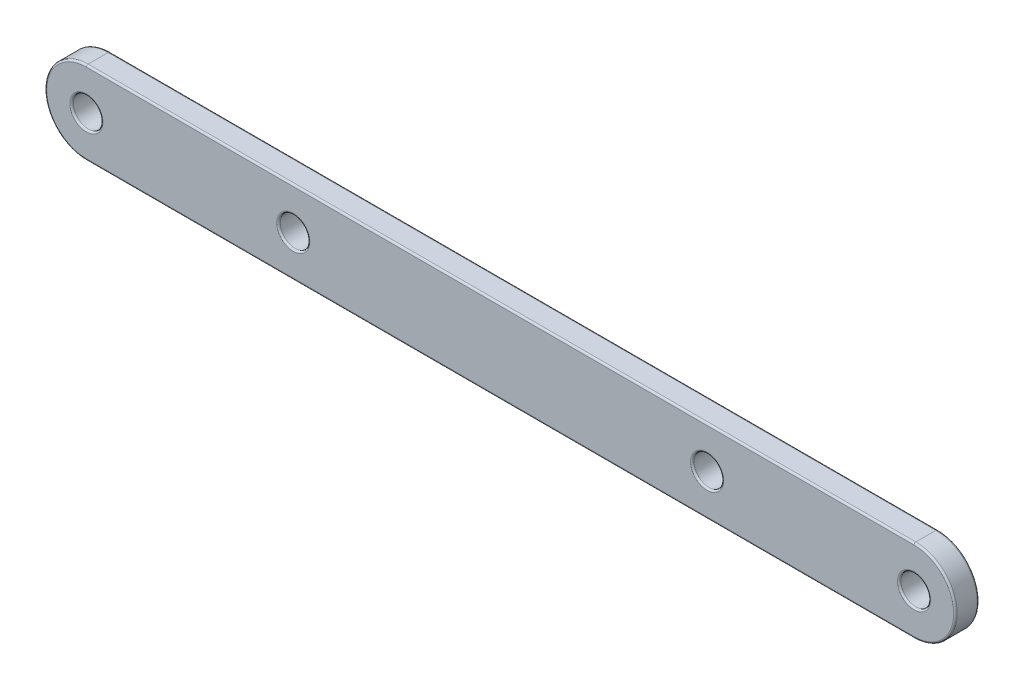
ISO-10303-21;
HEADER;
FILE_DESCRIPTION(('STEP AP214'),'2;1');
FILE_NAME('part.step','',(''),(''),'','','');
FILE_SCHEMA(('AUTOMOTIVE_DESIGN { 1 0 10303 214 1 1 1 1 }'));
ENDSEC;
DATA;
#1=APPLICATION_CONTEXT('core data for automotive mechanical design processes');
#2=APPLICATION_PROTOCOL_DEFINITION('international standard','automotive_design',2000,#1);
#3=PRODUCT_CONTEXT('',#1,'mechanical');
#4=PRODUCT('Part','Part','',(#3));
#5=PRODUCT_RELATED_PRODUCT_CATEGORY('part','',(#4));
#6=PRODUCT_DEFINITION_FORMATION('','',#4);
#7=PRODUCT_DEFINITION_CONTEXT('part definition',#1,'design');
#8=PRODUCT_DEFINITION('design','',#6,#7);
#9=PRODUCT_DEFINITION_SHAPE('','',#8);
#10=(LENGTH_UNIT() NAMED_UNIT(*) SI_UNIT(.MILLI.,.METRE.));
#11=(NAMED_UNIT(*) PLANE_ANGLE_UNIT() SI_UNIT($,.RADIAN.));
#12=(NAMED_UNIT(*) SI_UNIT($,.STERADIAN.) SOLID_ANGLE_UNIT());
#13=UNCERTAINTY_MEASURE_WITH_UNIT(LENGTH_MEASURE(1.E-05),#10,'distance_accuracy_value','');
#14=(GEOMETRIC_REPRESENTATION_CONTEXT(3) GLOBAL_UNCERTAINTY_ASSIGNED_CONTEXT((#13)) GLOBAL_UNIT_ASSIGNED_CONTEXT((#10,
#11,#12)) REPRESENTATION_CONTEXT('',''));
#15=CARTESIAN_POINT('',(0.,0.,0.));
#16=DIRECTION('',(0.,0.,1.));
#17=DIRECTION('',(1.,0.,0.));
#18=AXIS2_PLACEMENT_3D('',#15,#16,#17);
#19=CARTESIAN_POINT('',(-35.,0.,2.));
#20=DIRECTION('',(0.,0.,1.));
#21=DIRECTION('',(1.,0.,0.));
#22=AXIS2_PLACEMENT_3D('',#19,#20,#21);
#23=PLANE('',#22);
#24=CARTESIAN_POINT('',(17.5,0.,2.));
#25=DIRECTION('',(0.,0.,1.));
#26=DIRECTION('',(1.,0.,0.));
#27=AXIS2_PLACEMENT_3D('',#24,#25,#26);
#28=CIRCLE('',#27,1.4);
#29=CARTESIAN_POINT('',(18.9,0.,2.));
#30=VERTEX_POINT('',#29);
#31=EDGE_CURVE('E167',#30,#30,#28,.F.);
#32=ORIENTED_EDGE('',*,*,#31,.T.);
#33=EDGE_LOOP('',(#32));
#34=FACE_BOUND('',#33,.T.);
#35=CARTESIAN_POINT('',(35.,0.,2.));
#36=DIRECTION('',(0.,0.,1.));
#37=DIRECTION('',(1.,0.,0.));
#38=AXIS2_PLACEMENT_3D('',#35,#36,#37);
#39=CIRCLE('',#38,1.4);
#40=CARTESIAN_POINT('',(36.4,0.,2.));
#41=VERTEX_POINT('',#40);
#42=EDGE_CURVE('E164',#41,#41,#39,.F.);
#43=ORIENTED_EDGE('',*,*,#42,.T.);
#44=EDGE_LOOP('',(#43));
#45=FACE_BOUND('',#44,.T.);
#46=CARTESIAN_POINT('',(-35.,0.,2.));
#47=DIRECTION('',(0.,0.,1.));
#48=DIRECTION('',(1.,0.,0.));
#49=AXIS2_PLACEMENT_3D('',#46,#47,#48);
#50=CIRCLE('',#49,1.4);
#51=CARTESIAN_POINT('',(-33.6,0.,2.));
#52=VERTEX_POINT('',#51);
#53=EDGE_CURVE('E161',#52,#52,#50,.F.);
#54=ORIENTED_EDGE('',*,*,#53,.T.);
#55=EDGE_LOOP('',(#54));
#56=FACE_BOUND('',#55,.T.);
#57=CARTESIAN_POINT('',(-17.5,0.,2.));
#58=DIRECTION('',(0.,0.,1.));
#59=DIRECTION('',(1.,0.,0.));
#60=AXIS2_PLACEMENT_3D('',#57,#58,#59);
#61=CIRCLE('',#60,1.4);
#62=CARTESIAN_POINT('',(-16.1,0.,2.));
#63=VERTEX_POINT('',#62);
#64=EDGE_CURVE('E158',#63,#63,#61,.F.);
#65=ORIENTED_EDGE('',*,*,#64,.T.);
#66=EDGE_LOOP('',(#65));
#67=FACE_BOUND('',#66,.T.);
#68=DIRECTION('',(-1.,0.,0.));
#69=VECTOR('',#68,1.);
#70=CARTESIAN_POINT('',(-35.,3.35,2.));
#71=LINE('',#70,#69);
#72=CARTESIAN_POINT('',(35.,3.35000000000001,2.));
#73=VERTEX_POINT('',#72);
#74=CARTESIAN_POINT('',(-35.,3.35,2.));
#75=VERTEX_POINT('',#74);
#76=EDGE_CURVE('E149',#73,#75,#71,.T.);
#77=ORIENTED_EDGE('',*,*,#76,.T.);
#78=CARTESIAN_POINT('',(-35.,0.,2.));
#79=DIRECTION('',(0.,0.,1.));
#80=DIRECTION('',(1.,0.,0.));
#81=AXIS2_PLACEMENT_3D('',#78,#79,#80);
#82=CIRCLE('',#81,3.35);
#83=CARTESIAN_POINT('',(-35.,-3.35,2.));
#84=VERTEX_POINT('',#83);
#85=EDGE_CURVE('E155',#75,#84,#82,.T.);
#86=ORIENTED_EDGE('',*,*,#85,.T.);
#87=DIRECTION('',(1.,0.,0.));
#88=VECTOR('',#87,1.);
#89=CARTESIAN_POINT('',(35.,-3.34999999999999,2.));
#90=LINE('',#89,#88);
#91=CARTESIAN_POINT('',(35.,-3.34999999999999,2.));
#92=VERTEX_POINT('',#91);
#93=EDGE_CURVE('E153',#84,#92,#90,.T.);
#94=ORIENTED_EDGE('',*,*,#93,.T.);
#95=CARTESIAN_POINT('',(35.,0.,2.));
#96=DIRECTION('',(0.,0.,1.));
#97=DIRECTION('',(1.,0.,0.));
#98=AXIS2_PLACEMENT_3D('',#95,#96,#97);
#99=CIRCLE('',#98,3.35);
#100=EDGE_CURVE('E151',#92,#73,#99,.T.);
#101=ORIENTED_EDGE('',*,*,#100,.T.);
#102=EDGE_LOOP('',(#77,#86,#94,#101));
#103=FACE_BOUND('',#102,.T.);
#104=ADVANCED_FACE('F33',(#34,#45,#56,#67,#103),#23,.T.);
#105=CARTESIAN_POINT('',(-35.,0.,0.));
#106=DIRECTION('',(0.,0.,1.));
#107=DIRECTION('',(1.,0.,0.));
#108=AXIS2_PLACEMENT_3D('',#105,#106,#107);
#109=PLANE('',#108);
#110=CARTESIAN_POINT('',(17.5,0.,0.));
#111=DIRECTION('',(0.,0.,1.));
#112=DIRECTION('',(1.,0.,0.));
#113=AXIS2_PLACEMENT_3D('',#110,#111,#112);
#114=CIRCLE('',#113,1.4);
#115=CARTESIAN_POINT('',(18.9,0.,0.));
#116=VERTEX_POINT('',#115);
#117=EDGE_CURVE('E140',#116,#116,#114,.T.);
#118=ORIENTED_EDGE('',*,*,#117,.T.);
#119=EDGE_LOOP('',(#118));
#120=FACE_BOUND('',#119,.T.);
#121=CARTESIAN_POINT('',(35.,0.,0.));
#122=DIRECTION('',(0.,0.,1.));
#123=DIRECTION('',(1.,0.,0.));
#124=AXIS2_PLACEMENT_3D('',#121,#122,#123);
#125=CIRCLE('',#124,1.4);
#126=CARTESIAN_POINT('',(36.4,0.,0.));
#127=VERTEX_POINT('',#126);
#128=EDGE_CURVE('E137',#127,#127,#125,.T.);
#129=ORIENTED_EDGE('',*,*,#128,.T.);
#130=EDGE_LOOP('',(#129));
#131=FACE_BOUND('',#130,.T.);
#132=CARTESIAN_POINT('',(-35.,0.,0.));
#133=DIRECTION('',(0.,0.,1.));
#134=DIRECTION('',(1.,0.,0.));
#135=AXIS2_PLACEMENT_3D('',#132,#133,#134);
#136=CIRCLE('',#135,1.4);
#137=CARTESIAN_POINT('',(-33.6,0.,0.));
#138=VERTEX_POINT('',#137);
#139=EDGE_CURVE('E130',#138,#138,#136,.T.);
#140=ORIENTED_EDGE('',*,*,#139,.T.);
#141=EDGE_LOOP('',(#140));
#142=FACE_BOUND('',#141,.T.);
#143=CARTESIAN_POINT('',(-17.5,0.,0.));
#144=DIRECTION('',(0.,0.,1.));
#145=DIRECTION('',(1.,0.,0.));
#146=AXIS2_PLACEMENT_3D('',#143,#144,#145);
#147=CIRCLE('',#146,1.4);
#148=CARTESIAN_POINT('',(-16.1,0.,0.));
#149=VERTEX_POINT('',#148);
#150=EDGE_CURVE('E127',#149,#149,#147,.T.);
#151=ORIENTED_EDGE('',*,*,#150,.T.);
#152=EDGE_LOOP('',(#151));
#153=FACE_BOUND('',#152,.T.);
#154=DIRECTION('',(1.,0.,0.));
#155=VECTOR('',#154,1.);
#156=CARTESIAN_POINT('',(-35.,-3.35,0.));
#157=LINE('',#156,#155);
#158=CARTESIAN_POINT('',(35.,-3.34999999999999,0.));
#159=VERTEX_POINT('',#158);
#160=CARTESIAN_POINT('',(-35.,-3.35,0.));
#161=VERTEX_POINT('',#160);
#162=EDGE_CURVE('E126',#159,#161,#157,.F.);
#163=ORIENTED_EDGE('',*,*,#162,.T.);
#164=CARTESIAN_POINT('',(-35.,0.,0.));
#165=DIRECTION('',(0.,0.,1.));
#166=DIRECTION('',(1.,0.,0.));
#167=AXIS2_PLACEMENT_3D('',#164,#165,#166);
#168=CIRCLE('',#167,3.35);
#169=CARTESIAN_POINT('',(-35.,3.35,0.));
#170=VERTEX_POINT('',#169);
#171=EDGE_CURVE('E105',#161,#170,#168,.F.);
#172=ORIENTED_EDGE('',*,*,#171,.T.);
#173=DIRECTION('',(-1.,0.,0.));
#174=VECTOR('',#173,1.);
#175=CARTESIAN_POINT('',(-35.,3.35,0.));
#176=LINE('',#175,#174);
#177=CARTESIAN_POINT('',(35.,3.35000000000001,0.));
#178=VERTEX_POINT('',#177);
#179=EDGE_CURVE('E115',#170,#178,#176,.F.);
#180=ORIENTED_EDGE('',*,*,#179,.T.);
#181=CARTESIAN_POINT('',(35.,0.,0.));
#182=DIRECTION('',(0.,0.,1.));
#183=DIRECTION('',(1.,0.,0.));
#184=AXIS2_PLACEMENT_3D('',#181,#182,#183);
#185=CIRCLE('',#184,3.35);
#186=EDGE_CURVE('E121',#178,#159,#185,.F.);
#187=ORIENTED_EDGE('',*,*,#186,.T.);
#188=EDGE_LOOP('',(#163,#172,#180,#187));
#189=FACE_BOUND('',#188,.T.);
#190=ADVANCED_FACE('F124',(#120,#131,#142,#153,#189),#109,.F.);
#191=CARTESIAN_POINT('',(-35.,0.,2.));
#192=DIRECTION('',(0.,0.,-1.));
#193=DIRECTION('',(-1.,0.,0.));
#194=AXIS2_PLACEMENT_3D('',#191,#192,#193);
#195=CYLINDRICAL_SURFACE('',#194,3.5);
#196=DIRECTION('',(0.,0.,-1.));
#197=VECTOR('',#196,1.);
#198=CARTESIAN_POINT('',(-35.,3.5,2.));
#199=LINE('',#198,#197);
#200=CARTESIAN_POINT('',(-35.,3.5,1.85));
#201=VERTEX_POINT('',#200);
#202=CARTESIAN_POINT('',(-35.,3.5,0.15));
#203=VERTEX_POINT('',#202);
#204=EDGE_CURVE('E204',#201,#203,#199,.T.);
#205=ORIENTED_EDGE('',*,*,#204,.T.);
#206=CARTESIAN_POINT('',(-35.,0.,0.15));
#207=DIRECTION('',(0.,0.,1.));
#208=DIRECTION('',(1.,0.,0.));
#209=AXIS2_PLACEMENT_3D('',#206,#207,#208);
#210=CIRCLE('',#209,3.5);
#211=CARTESIAN_POINT('',(-35.,-3.5,0.15));
#212=VERTEX_POINT('',#211);
#213=EDGE_CURVE('E108',#203,#212,#210,.T.);
#214=ORIENTED_EDGE('',*,*,#213,.T.);
#215=DIRECTION('',(0.,0.,-1.));
#216=VECTOR('',#215,1.);
#217=CARTESIAN_POINT('',(-35.,-3.5,2.));
#218=LINE('',#217,#216);
#219=CARTESIAN_POINT('',(-35.,-3.5,1.85));
#220=VERTEX_POINT('',#219);
#221=EDGE_CURVE('E122',#220,#212,#218,.T.);
#222=ORIENTED_EDGE('',*,*,#221,.F.);
#223=CARTESIAN_POINT('',(-35.,0.,1.85));
#224=DIRECTION('',(0.,0.,1.));
#225=DIRECTION('',(1.,0.,0.));
#226=AXIS2_PLACEMENT_3D('',#223,#224,#225);
#227=CIRCLE('',#226,3.5);
#228=EDGE_CURVE('E188',#220,#201,#227,.F.);
#229=ORIENTED_EDGE('',*,*,#228,.T.);
#230=EDGE_LOOP('',(#205,#214,#222,#229));
#231=FACE_BOUND('',#230,.T.);
#232=ADVANCED_FACE('F243',(#231),#195,.T.);
#233=CARTESIAN_POINT('',(-35.,-3.5,2.));
#234=DIRECTION('',(0.,1.,0.));
#235=DIRECTION('',(-1.,0.,0.));
#236=AXIS2_PLACEMENT_3D('',#233,#234,#235);
#237=PLANE('',#236);
#238=ORIENTED_EDGE('',*,*,#221,.T.);
#239=DIRECTION('',(1.,0.,0.));
#240=VECTOR('',#239,1.);
#241=CARTESIAN_POINT('',(-35.,-3.5,0.15));
#242=LINE('',#241,#240);
#243=CARTESIAN_POINT('',(35.,-3.49999999999999,0.15));
#244=VERTEX_POINT('',#243);
#245=EDGE_CURVE('E194',#212,#244,#242,.T.);
#246=ORIENTED_EDGE('',*,*,#245,.T.);
#247=DIRECTION('',(0.,0.,-1.));
#248=VECTOR('',#247,1.);
#249=CARTESIAN_POINT('',(35.,-3.49999999999999,2.));
#250=LINE('',#249,#248);
#251=CARTESIAN_POINT('',(35.,-3.49999999999999,1.85));
#252=VERTEX_POINT('',#251);
#253=EDGE_CURVE('E225',#252,#244,#250,.T.);
#254=ORIENTED_EDGE('',*,*,#253,.F.);
#255=DIRECTION('',(1.,0.,0.));
#256=VECTOR('',#255,1.);
#257=CARTESIAN_POINT('',(-35.,-3.5,1.85));
#258=LINE('',#257,#256);
#259=EDGE_CURVE('E192',#252,#220,#258,.F.);
#260=ORIENTED_EDGE('',*,*,#259,.T.);
#261=EDGE_LOOP('',(#238,#246,#254,#260));
#262=FACE_BOUND('',#261,.T.);
#263=ADVANCED_FACE('F229',(#262),#237,.F.);
#264=CARTESIAN_POINT('',(35.,0.,2.));
#265=DIRECTION('',(0.,0.,-1.));
#266=DIRECTION('',(-1.,0.,0.));
#267=AXIS2_PLACEMENT_3D('',#264,#265,#266);
#268=CYLINDRICAL_SURFACE('',#267,3.5);
#269=ORIENTED_EDGE('',*,*,#253,.T.);
#270=CARTESIAN_POINT('',(35.,0.,0.15));
#271=DIRECTION('',(0.,0.,1.));
#272=DIRECTION('',(1.,0.,0.));
#273=AXIS2_PLACEMENT_3D('',#270,#271,#272);
#274=CIRCLE('',#273,3.5);
#275=CARTESIAN_POINT('',(35.,3.50000000000001,0.15));
#276=VERTEX_POINT('',#275);
#277=EDGE_CURVE('E50',#244,#276,#274,.T.);
#278=ORIENTED_EDGE('',*,*,#277,.T.);
#279=DIRECTION('',(0.,0.,-1.));
#280=VECTOR('',#279,1.);
#281=CARTESIAN_POINT('',(35.,3.50000000000001,2.));
#282=LINE('',#281,#280);
#283=CARTESIAN_POINT('',(35.,3.50000000000001,1.85));
#284=VERTEX_POINT('',#283);
#285=EDGE_CURVE('E226',#284,#276,#282,.T.);
#286=ORIENTED_EDGE('',*,*,#285,.F.);
#287=CARTESIAN_POINT('',(35.,0.,1.85));
#288=DIRECTION('',(0.,0.,1.));
#289=DIRECTION('',(1.,0.,0.));
#290=AXIS2_PLACEMENT_3D('',#287,#288,#289);
#291=CIRCLE('',#290,3.5);
#292=EDGE_CURVE('E196',#284,#252,#291,.F.);
#293=ORIENTED_EDGE('',*,*,#292,.T.);
#294=EDGE_LOOP('',(#269,#278,#286,#293));
#295=FACE_BOUND('',#294,.T.);
#296=ADVANCED_FACE('F224',(#295),#268,.T.);
#297=CARTESIAN_POINT('',(35.,3.50000000000001,2.));
#298=DIRECTION('',(0.,-1.,0.));
#299=DIRECTION('',(1.,0.,0.));
#300=AXIS2_PLACEMENT_3D('',#297,#298,#299);
#301=PLANE('',#300);
#302=ORIENTED_EDGE('',*,*,#285,.T.);
#303=DIRECTION('',(-1.,0.,0.));
#304=VECTOR('',#303,1.);
#305=CARTESIAN_POINT('',(35.,3.50000000000001,0.15));
#306=LINE('',#305,#304);
#307=EDGE_CURVE('E11',#276,#203,#306,.T.);
#308=ORIENTED_EDGE('',*,*,#307,.T.);
#309=ORIENTED_EDGE('',*,*,#204,.F.);
#310=DIRECTION('',(-1.,0.,0.));
#311=VECTOR('',#310,1.);
#312=CARTESIAN_POINT('',(35.,3.50000000000001,1.85));
#313=LINE('',#312,#311);
#314=EDGE_CURVE('E42',#201,#284,#313,.F.);
#315=ORIENTED_EDGE('',*,*,#314,.T.);
#316=EDGE_LOOP('',(#302,#308,#309,#315));
#317=FACE_BOUND('',#316,.T.);
#318=ADVANCED_FACE('F245',(#317),#301,.F.);
#319=CARTESIAN_POINT('',(-17.5,0.,2.));
#320=DIRECTION('',(0.,0.,-1.));
#321=DIRECTION('',(-1.,0.,0.));
#322=AXIS2_PLACEMENT_3D('',#319,#320,#321);
#323=CYLINDRICAL_SURFACE('',#322,1.25);
#324=CARTESIAN_POINT('',(-17.5,0.,0.15));
#325=DIRECTION('',(0.,0.,1.));
#326=DIRECTION('',(1.,0.,0.));
#327=AXIS2_PLACEMENT_3D('',#324,#325,#326);
#328=CIRCLE('',#327,1.25);
#329=CARTESIAN_POINT('',(-16.25,0.,0.15));
#330=VERTEX_POINT('',#329);
#331=EDGE_CURVE('E185',#330,#330,#328,.F.);
#332=ORIENTED_EDGE('',*,*,#331,.T.);
#333=EDGE_LOOP('',(#332));
#334=FACE_BOUND('',#333,.T.);
#335=CARTESIAN_POINT('',(-17.5,0.,1.85));
#336=DIRECTION('',(0.,0.,1.));
#337=DIRECTION('',(1.,0.,0.));
#338=AXIS2_PLACEMENT_3D('',#335,#336,#337);
#339=CIRCLE('',#338,1.25);
#340=CARTESIAN_POINT('',(-16.25,0.,1.85));
#341=VERTEX_POINT('',#340);
#342=EDGE_CURVE('E182',#341,#341,#339,.T.);
#343=ORIENTED_EDGE('',*,*,#342,.T.);
#344=EDGE_LOOP('',(#343));
#345=FACE_BOUND('',#344,.T.);
#346=ADVANCED_FACE('F247',(#334,#345),#323,.F.);
#347=CARTESIAN_POINT('',(-35.,0.,2.));
#348=DIRECTION('',(0.,0.,-1.));
#349=DIRECTION('',(-1.,0.,0.));
#350=AXIS2_PLACEMENT_3D('',#347,#348,#349);
#351=CYLINDRICAL_SURFACE('',#350,1.25);
#352=CARTESIAN_POINT('',(-35.,0.,0.15));
#353=DIRECTION('',(0.,0.,1.));
#354=DIRECTION('',(1.,0.,0.));
#355=AXIS2_PLACEMENT_3D('',#352,#353,#354);
#356=CIRCLE('',#355,1.25);
#357=CARTESIAN_POINT('',(-33.75,0.,0.15));
#358=VERTEX_POINT('',#357);
#359=EDGE_CURVE('E179',#358,#358,#356,.F.);
#360=ORIENTED_EDGE('',*,*,#359,.T.);
#361=EDGE_LOOP('',(#360));
#362=FACE_BOUND('',#361,.T.);
#363=CARTESIAN_POINT('',(-35.,0.,1.85));
#364=DIRECTION('',(0.,0.,1.));
#365=DIRECTION('',(1.,0.,0.));
#366=AXIS2_PLACEMENT_3D('',#363,#364,#365);
#367=CIRCLE('',#366,1.25);
#368=CARTESIAN_POINT('',(-33.75,0.,1.85));
#369=VERTEX_POINT('',#368);
#370=EDGE_CURVE('E176',#369,#369,#367,.T.);
#371=ORIENTED_EDGE('',*,*,#370,.T.);
#372=EDGE_LOOP('',(#371));
#373=FACE_BOUND('',#372,.T.);
#374=ADVANCED_FACE('F253',(#362,#373),#351,.F.);
#375=CARTESIAN_POINT('',(35.,0.,2.));
#376=DIRECTION('',(0.,0.,-1.));
#377=DIRECTION('',(-1.,0.,0.));
#378=AXIS2_PLACEMENT_3D('',#375,#376,#377);
#379=CYLINDRICAL_SURFACE('',#378,1.25);
#380=CARTESIAN_POINT('',(35.,0.,0.15));
#381=DIRECTION('',(0.,0.,1.));
#382=DIRECTION('',(1.,0.,0.));
#383=AXIS2_PLACEMENT_3D('',#380,#381,#382);
#384=CIRCLE('',#383,1.25);
#385=CARTESIAN_POINT('',(36.25,0.,0.15));
#386=VERTEX_POINT('',#385);
#387=EDGE_CURVE('E173',#386,#386,#384,.F.);
#388=ORIENTED_EDGE('',*,*,#387,.T.);
#389=EDGE_LOOP('',(#388));
#390=FACE_BOUND('',#389,.T.);
#391=CARTESIAN_POINT('',(35.,0.,1.85));
#392=DIRECTION('',(0.,0.,1.));
#393=DIRECTION('',(1.,0.,0.));
#394=AXIS2_PLACEMENT_3D('',#391,#392,#393);
#395=CIRCLE('',#394,1.25);
#396=CARTESIAN_POINT('',(36.25,0.,1.85));
#397=VERTEX_POINT('',#396);
#398=EDGE_CURVE('E170',#397,#397,#395,.T.);
#399=ORIENTED_EDGE('',*,*,#398,.T.);
#400=EDGE_LOOP('',(#399));
#401=FACE_BOUND('',#400,.T.);
#402=ADVANCED_FACE('F269',(#390,#401),#379,.F.);
#403=CARTESIAN_POINT('',(17.5,0.,2.));
#404=DIRECTION('',(0.,0.,-1.));
#405=DIRECTION('',(-1.,0.,0.));
#406=AXIS2_PLACEMENT_3D('',#403,#404,#405);
#407=CYLINDRICAL_SURFACE('',#406,1.25);
#408=CARTESIAN_POINT('',(17.5,0.,0.15));
#409=DIRECTION('',(0.,0.,1.));
#410=DIRECTION('',(1.,0.,0.));
#411=AXIS2_PLACEMENT_3D('',#408,#409,#410);
#412=CIRCLE('',#411,1.25);
#413=CARTESIAN_POINT('',(18.75,0.,0.15));
#414=VERTEX_POINT('',#413);
#415=EDGE_CURVE('E146',#414,#414,#412,.F.);
#416=ORIENTED_EDGE('',*,*,#415,.T.);
#417=EDGE_LOOP('',(#416));
#418=FACE_BOUND('',#417,.T.);
#419=CARTESIAN_POINT('',(17.5,0.,1.85));
#420=DIRECTION('',(0.,0.,1.));
#421=DIRECTION('',(1.,0.,0.));
#422=AXIS2_PLACEMENT_3D('',#419,#420,#421);
#423=CIRCLE('',#422,1.25);
#424=CARTESIAN_POINT('',(18.75,0.,1.85));
#425=VERTEX_POINT('',#424);
#426=EDGE_CURVE('E143',#425,#425,#423,.T.);
#427=ORIENTED_EDGE('',*,*,#426,.T.);
#428=EDGE_LOOP('',(#427));
#429=FACE_BOUND('',#428,.T.);
#430=ADVANCED_FACE('F273',(#418,#429),#407,.F.);
#431=CARTESIAN_POINT('',(17.5,0.,0.15));
#432=DIRECTION('',(0.,0.,1.));
#433=DIRECTION('',(1.,0.,0.));
#434=AXIS2_PLACEMENT_3D('',#431,#432,#433);
#435=TOROIDAL_SURFACE('',#434,1.4,0.15);
#436=ORIENTED_EDGE('',*,*,#415,.F.);
#437=EDGE_LOOP('',(#436));
#438=FACE_BOUND('',#437,.T.);
#439=ORIENTED_EDGE('',*,*,#117,.F.);
#440=EDGE_LOOP('',(#439));
#441=FACE_BOUND('',#440,.T.);
#442=ADVANCED_FACE('F276',(#438,#441),#435,.T.);
#443=CARTESIAN_POINT('',(17.5,0.,1.85));
#444=DIRECTION('',(0.,0.,1.));
#445=DIRECTION('',(1.,0.,0.));
#446=AXIS2_PLACEMENT_3D('',#443,#444,#445);
#447=TOROIDAL_SURFACE('',#446,1.4,0.15);
#448=ORIENTED_EDGE('',*,*,#31,.F.);
#449=EDGE_LOOP('',(#448));
#450=FACE_BOUND('',#449,.T.);
#451=ORIENTED_EDGE('',*,*,#426,.F.);
#452=EDGE_LOOP('',(#451));
#453=FACE_BOUND('',#452,.T.);
#454=ADVANCED_FACE('F281',(#450,#453),#447,.T.);
#455=CARTESIAN_POINT('',(35.,0.,0.15));
#456=DIRECTION('',(0.,0.,1.));
#457=DIRECTION('',(1.,0.,0.));
#458=AXIS2_PLACEMENT_3D('',#455,#456,#457);
#459=TOROIDAL_SURFACE('',#458,1.4,0.15);
#460=ORIENTED_EDGE('',*,*,#387,.F.);
#461=EDGE_LOOP('',(#460));
#462=FACE_BOUND('',#461,.T.);
#463=ORIENTED_EDGE('',*,*,#128,.F.);
#464=EDGE_LOOP('',(#463));
#465=FACE_BOUND('',#464,.T.);
#466=ADVANCED_FACE('F289',(#462,#465),#459,.T.);
#467=CARTESIAN_POINT('',(35.,0.,1.85));
#468=DIRECTION('',(0.,0.,1.));
#469=DIRECTION('',(1.,0.,0.));
#470=AXIS2_PLACEMENT_3D('',#467,#468,#469);
#471=TOROIDAL_SURFACE('',#470,1.4,0.15);
#472=ORIENTED_EDGE('',*,*,#42,.F.);
#473=EDGE_LOOP('',(#472));
#474=FACE_BOUND('',#473,.T.);
#475=ORIENTED_EDGE('',*,*,#398,.F.);
#476=EDGE_LOOP('',(#475));
#477=FACE_BOUND('',#476,.T.);
#478=ADVANCED_FACE('F295',(#474,#477),#471,.T.);
#479=CARTESIAN_POINT('',(-35.,0.,0.15));
#480=DIRECTION('',(0.,0.,1.));
#481=DIRECTION('',(1.,0.,0.));
#482=AXIS2_PLACEMENT_3D('',#479,#480,#481);
#483=TOROIDAL_SURFACE('',#482,1.4,0.15);
#484=ORIENTED_EDGE('',*,*,#359,.F.);
#485=EDGE_LOOP('',(#484));
#486=FACE_BOUND('',#485,.T.);
#487=ORIENTED_EDGE('',*,*,#139,.F.);
#488=EDGE_LOOP('',(#487));
#489=FACE_BOUND('',#488,.T.);
#490=ADVANCED_FACE('F303',(#486,#489),#483,.T.);
#491=CARTESIAN_POINT('',(-35.,0.,1.85));
#492=DIRECTION('',(0.,0.,1.));
#493=DIRECTION('',(1.,0.,0.));
#494=AXIS2_PLACEMENT_3D('',#491,#492,#493);
#495=TOROIDAL_SURFACE('',#494,1.4,0.15);
#496=ORIENTED_EDGE('',*,*,#53,.F.);
#497=EDGE_LOOP('',(#496));
#498=FACE_BOUND('',#497,.T.);
#499=ORIENTED_EDGE('',*,*,#370,.F.);
#500=EDGE_LOOP('',(#499));
#501=FACE_BOUND('',#500,.T.);
#502=ADVANCED_FACE('F307',(#498,#501),#495,.T.);
#503=CARTESIAN_POINT('',(-17.5,0.,0.15));
#504=DIRECTION('',(0.,0.,1.));
#505=DIRECTION('',(1.,0.,0.));
#506=AXIS2_PLACEMENT_3D('',#503,#504,#505);
#507=TOROIDAL_SURFACE('',#506,1.4,0.15);
#508=ORIENTED_EDGE('',*,*,#331,.F.);
#509=EDGE_LOOP('',(#508));
#510=FACE_BOUND('',#509,.T.);
#511=ORIENTED_EDGE('',*,*,#150,.F.);
#512=EDGE_LOOP('',(#511));
#513=FACE_BOUND('',#512,.T.);
#514=ADVANCED_FACE('F311',(#510,#513),#507,.T.);
#515=CARTESIAN_POINT('',(-17.5,0.,1.85));
#516=DIRECTION('',(0.,0.,1.));
#517=DIRECTION('',(1.,0.,0.));
#518=AXIS2_PLACEMENT_3D('',#515,#516,#517);
#519=TOROIDAL_SURFACE('',#518,1.4,0.15);
#520=ORIENTED_EDGE('',*,*,#64,.F.);
#521=EDGE_LOOP('',(#520));
#522=FACE_BOUND('',#521,.T.);
#523=ORIENTED_EDGE('',*,*,#342,.F.);
#524=EDGE_LOOP('',(#523));
#525=FACE_BOUND('',#524,.T.);
#526=ADVANCED_FACE('F315',(#522,#525),#519,.T.);
#527=CARTESIAN_POINT('',(35.,0.,0.15));
#528=DIRECTION('',(0.,0.,1.));
#529=DIRECTION('',(1.,0.,0.));
#530=AXIS2_PLACEMENT_3D('',#527,#528,#529);
#531=TOROIDAL_SURFACE('',#530,3.35,0.15);
#532=CARTESIAN_POINT('',(35.,-3.34999999999999,0.15));
#533=DIRECTION('',(-1.,0.,0.));
#534=DIRECTION('',(0.,0.,1.));
#535=AXIS2_PLACEMENT_3D('',#532,#533,#534);
#536=CIRCLE('',#535,0.15);
#537=EDGE_CURVE('E111',#159,#244,#536,.T.);
#538=ORIENTED_EDGE('',*,*,#537,.F.);
#539=ORIENTED_EDGE('',*,*,#186,.F.);
#540=CARTESIAN_POINT('',(35.,3.35000000000001,0.15));
#541=DIRECTION('',(-1.,0.,0.));
#542=DIRECTION('',(0.,0.,1.));
#543=AXIS2_PLACEMENT_3D('',#540,#541,#542);
#544=CIRCLE('',#543,0.15);
#545=EDGE_CURVE('E118',#276,#178,#544,.T.);
#546=ORIENTED_EDGE('',*,*,#545,.F.);
#547=ORIENTED_EDGE('',*,*,#277,.F.);
#548=EDGE_LOOP('',(#538,#539,#546,#547));
#549=FACE_BOUND('',#548,.T.);
#550=ADVANCED_FACE('F238',(#549),#531,.T.);
#551=CARTESIAN_POINT('',(35.,3.35000000000001,0.15));
#552=DIRECTION('',(-1.,0.,0.));
#553=DIRECTION('',(0.,-1.,0.));
#554=AXIS2_PLACEMENT_3D('',#551,#552,#553);
#555=CYLINDRICAL_SURFACE('',#554,0.15);
#556=ORIENTED_EDGE('',*,*,#545,.T.);
#557=ORIENTED_EDGE('',*,*,#179,.F.);
#558=CARTESIAN_POINT('',(-35.,3.35,0.15));
#559=DIRECTION('',(-1.,0.,0.));
#560=DIRECTION('',(0.,0.,1.));
#561=AXIS2_PLACEMENT_3D('',#558,#559,#560);
#562=CIRCLE('',#561,0.15);
#563=EDGE_CURVE('E101',#203,#170,#562,.T.);
#564=ORIENTED_EDGE('',*,*,#563,.F.);
#565=ORIENTED_EDGE('',*,*,#307,.F.);
#566=EDGE_LOOP('',(#556,#557,#564,#565));
#567=FACE_BOUND('',#566,.T.);
#568=ADVANCED_FACE('F116',(#567),#555,.T.);
#569=CARTESIAN_POINT('',(-35.,-3.35,0.15));
#570=DIRECTION('',(1.,0.,0.));
#571=DIRECTION('',(0.,1.,0.));
#572=AXIS2_PLACEMENT_3D('',#569,#570,#571);
#573=CYLINDRICAL_SURFACE('',#572,0.15);
#574=ORIENTED_EDGE('',*,*,#537,.T.);
#575=ORIENTED_EDGE('',*,*,#245,.F.);
#576=CARTESIAN_POINT('',(-35.,-3.35,0.15));
#577=DIRECTION('',(-1.,0.,0.));
#578=DIRECTION('',(0.,0.,1.));
#579=AXIS2_PLACEMENT_3D('',#576,#577,#578);
#580=CIRCLE('',#579,0.15);
#581=EDGE_CURVE('E112',#161,#212,#580,.T.);
#582=ORIENTED_EDGE('',*,*,#581,.F.);
#583=ORIENTED_EDGE('',*,*,#162,.F.);
#584=EDGE_LOOP('',(#574,#575,#582,#583));
#585=FACE_BOUND('',#584,.T.);
#586=ADVANCED_FACE('F240',(#585),#573,.T.);
#587=CARTESIAN_POINT('',(-35.,0.,0.15));
#588=DIRECTION('',(0.,0.,1.));
#589=DIRECTION('',(1.,0.,0.));
#590=AXIS2_PLACEMENT_3D('',#587,#588,#589);
#591=TOROIDAL_SURFACE('',#590,3.35,0.15);
#592=ORIENTED_EDGE('',*,*,#563,.T.);
#593=ORIENTED_EDGE('',*,*,#171,.F.);
#594=ORIENTED_EDGE('',*,*,#581,.T.);
#595=ORIENTED_EDGE('',*,*,#213,.F.);
#596=EDGE_LOOP('',(#592,#593,#594,#595));
#597=FACE_BOUND('',#596,.T.);
#598=ADVANCED_FACE('F103',(#597),#591,.T.);
#599=CARTESIAN_POINT('',(35.,0.,1.85));
#600=DIRECTION('',(0.,0.,1.));
#601=DIRECTION('',(1.,0.,0.));
#602=AXIS2_PLACEMENT_3D('',#599,#600,#601);
#603=TOROIDAL_SURFACE('',#602,3.35,0.15);
#604=CARTESIAN_POINT('',(35.,-3.34999999999999,1.85));
#605=DIRECTION('',(-1.,0.,0.));
#606=DIRECTION('',(0.,0.,1.));
#607=AXIS2_PLACEMENT_3D('',#604,#605,#606);
#608=CIRCLE('',#607,0.15);
#609=EDGE_CURVE('E208',#252,#92,#608,.T.);
#610=ORIENTED_EDGE('',*,*,#609,.F.);
#611=ORIENTED_EDGE('',*,*,#292,.F.);
#612=CARTESIAN_POINT('',(35.,3.35000000000001,1.85));
#613=DIRECTION('',(-1.,0.,0.));
#614=DIRECTION('',(0.,0.,1.));
#615=AXIS2_PLACEMENT_3D('',#612,#613,#614);
#616=CIRCLE('',#615,0.15);
#617=EDGE_CURVE('E37',#73,#284,#616,.T.);
#618=ORIENTED_EDGE('',*,*,#617,.F.);
#619=ORIENTED_EDGE('',*,*,#100,.F.);
#620=EDGE_LOOP('',(#610,#611,#618,#619));
#621=FACE_BOUND('',#620,.T.);
#622=ADVANCED_FACE('F35',(#621),#603,.T.);
#623=CARTESIAN_POINT('',(-35.,3.35,1.85));
#624=DIRECTION('',(1.,0.,0.));
#625=DIRECTION('',(0.,1.,0.));
#626=AXIS2_PLACEMENT_3D('',#623,#624,#625);
#627=CYLINDRICAL_SURFACE('',#626,0.15);
#628=ORIENTED_EDGE('',*,*,#617,.T.);
#629=ORIENTED_EDGE('',*,*,#314,.F.);
#630=CARTESIAN_POINT('',(-35.,3.35,1.85));
#631=DIRECTION('',(-1.,0.,0.));
#632=DIRECTION('',(0.,0.,1.));
#633=AXIS2_PLACEMENT_3D('',#630,#631,#632);
#634=CIRCLE('',#633,0.15);
#635=EDGE_CURVE('E207',#75,#201,#634,.T.);
#636=ORIENTED_EDGE('',*,*,#635,.F.);
#637=ORIENTED_EDGE('',*,*,#76,.F.);
#638=EDGE_LOOP('',(#628,#629,#636,#637));
#639=FACE_BOUND('',#638,.T.);
#640=ADVANCED_FACE('F218',(#639),#627,.T.);
#641=CARTESIAN_POINT('',(-35.,-3.35,1.85));
#642=DIRECTION('',(-1.,0.,0.));
#643=DIRECTION('',(0.,-1.,0.));
#644=AXIS2_PLACEMENT_3D('',#641,#642,#643);
#645=CYLINDRICAL_SURFACE('',#644,0.15);
#646=ORIENTED_EDGE('',*,*,#609,.T.);
#647=ORIENTED_EDGE('',*,*,#93,.F.);
#648=CARTESIAN_POINT('',(-35.,-3.35,1.85));
#649=DIRECTION('',(-1.,0.,0.));
#650=DIRECTION('',(0.,0.,1.));
#651=AXIS2_PLACEMENT_3D('',#648,#649,#650);
#652=CIRCLE('',#651,0.15);
#653=EDGE_CURVE('E205',#220,#84,#652,.T.);
#654=ORIENTED_EDGE('',*,*,#653,.F.);
#655=ORIENTED_EDGE('',*,*,#259,.F.);
#656=EDGE_LOOP('',(#646,#647,#654,#655));
#657=FACE_BOUND('',#656,.T.);
#658=ADVANCED_FACE('F331',(#657),#645,.T.);
#659=CARTESIAN_POINT('',(-35.,0.,1.85));
#660=DIRECTION('',(0.,0.,1.));
#661=DIRECTION('',(1.,0.,0.));
#662=AXIS2_PLACEMENT_3D('',#659,#660,#661);
#663=TOROIDAL_SURFACE('',#662,3.35,0.15);
#664=ORIENTED_EDGE('',*,*,#635,.T.);
#665=ORIENTED_EDGE('',*,*,#228,.F.);
#666=ORIENTED_EDGE('',*,*,#653,.T.);
#667=ORIENTED_EDGE('',*,*,#85,.F.);
#668=EDGE_LOOP('',(#664,#665,#666,#667));
#669=FACE_BOUND('',#668,.T.);
#670=ADVANCED_FACE('F328',(#669),#663,.T.);
#671=CLOSED_SHELL('',(#104,#190,#232,#263,#296,#318,#346,#374,#402,#430,#442,#454,#466,#478,
#490,#502,#514,#526,#550,#568,#586,#598,#622,#640,#658,#670));
#672=MANIFOLD_SOLID_BREP('B2',#671);
#673=ADVANCED_BREP_SHAPE_REPRESENTATION('',(#18,#672),#14);
#674=SHAPE_DEFINITION_REPRESENTATION(#9,#673);
ENDSEC;
END-ISO-10303-21;
